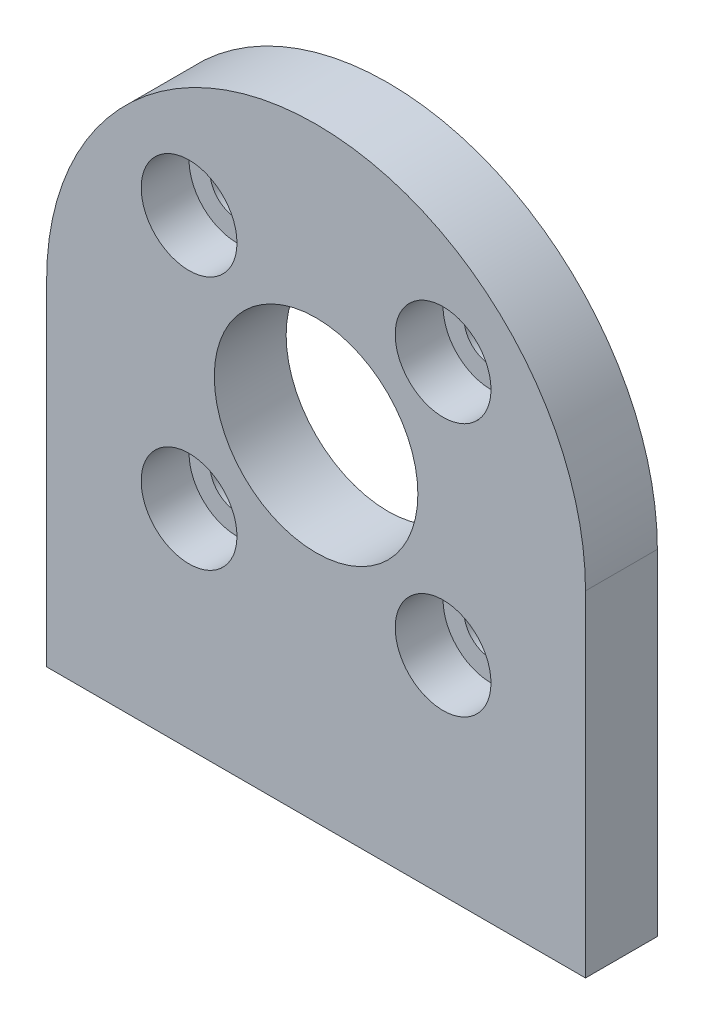
ISO-10303-21;
HEADER;
FILE_DESCRIPTION(('STEP AP214'),'2;1');
FILE_NAME('part.step','',(''),(''),'','','');
FILE_SCHEMA(('AUTOMOTIVE_DESIGN { 1 0 10303 214 1 1 1 1 }'));
ENDSEC;
DATA;
#1=APPLICATION_CONTEXT('core data for automotive mechanical design processes');
#2=APPLICATION_PROTOCOL_DEFINITION('international standard','automotive_design',2000,#1);
#3=PRODUCT_CONTEXT('',#1,'mechanical');
#4=PRODUCT('Part','Part','',(#3));
#5=PRODUCT_RELATED_PRODUCT_CATEGORY('part','',(#4));
#6=PRODUCT_DEFINITION_FORMATION('','',#4);
#7=PRODUCT_DEFINITION_CONTEXT('part definition',#1,'design');
#8=PRODUCT_DEFINITION('design','',#6,#7);
#9=PRODUCT_DEFINITION_SHAPE('','',#8);
#10=(LENGTH_UNIT() NAMED_UNIT(*) SI_UNIT(.MILLI.,.METRE.));
#11=(NAMED_UNIT(*) PLANE_ANGLE_UNIT() SI_UNIT($,.RADIAN.));
#12=(NAMED_UNIT(*) SI_UNIT($,.STERADIAN.) SOLID_ANGLE_UNIT());
#13=UNCERTAINTY_MEASURE_WITH_UNIT(LENGTH_MEASURE(1.E-05),#10,'distance_accuracy_value','');
#14=(GEOMETRIC_REPRESENTATION_CONTEXT(3) GLOBAL_UNCERTAINTY_ASSIGNED_CONTEXT((#13)) GLOBAL_UNIT_ASSIGNED_CONTEXT((#10,
#11,#12)) REPRESENTATION_CONTEXT('',''));
#15=CARTESIAN_POINT('',(0.,0.,0.));
#16=DIRECTION('',(0.,0.,1.));
#17=DIRECTION('',(1.,0.,0.));
#18=AXIS2_PLACEMENT_3D('',#15,#16,#17);
#19=CARTESIAN_POINT('',(22.5,28.,6.));
#20=DIRECTION('',(0.,0.,-1.));
#21=DIRECTION('',(-1.,0.,0.));
#22=AXIS2_PLACEMENT_3D('',#19,#20,#21);
#23=CYLINDRICAL_SURFACE('',#22,22.5);
#24=CARTESIAN_POINT('',(22.5,28.,0.));
#25=DIRECTION('',(0.,0.,1.));
#26=DIRECTION('',(1.,0.,0.));
#27=AXIS2_PLACEMENT_3D('',#24,#25,#26);
#28=CIRCLE('',#27,22.5);
#29=CARTESIAN_POINT('',(45.,28.,0.));
#30=VERTEX_POINT('',#29);
#31=CARTESIAN_POINT('',(0.,28.,0.));
#32=VERTEX_POINT('',#31);
#33=EDGE_CURVE('E98',#30,#32,#28,.T.);
#34=ORIENTED_EDGE('',*,*,#33,.T.);
#35=DIRECTION('',(0.,0.,-1.));
#36=VECTOR('',#35,1.);
#37=CARTESIAN_POINT('',(0.,28.,6.));
#38=LINE('',#37,#36);
#39=CARTESIAN_POINT('',(0.,28.,6.));
#40=VERTEX_POINT('',#39);
#41=EDGE_CURVE('E11',#40,#32,#38,.T.);
#42=ORIENTED_EDGE('',*,*,#41,.F.);
#43=CARTESIAN_POINT('',(22.5,28.,6.));
#44=DIRECTION('',(0.,0.,1.));
#45=DIRECTION('',(1.,0.,0.));
#46=AXIS2_PLACEMENT_3D('',#43,#44,#45);
#47=CIRCLE('',#46,22.5);
#48=CARTESIAN_POINT('',(45.,28.,6.));
#49=VERTEX_POINT('',#48);
#50=EDGE_CURVE('E86',#49,#40,#47,.T.);
#51=ORIENTED_EDGE('',*,*,#50,.F.);
#52=DIRECTION('',(0.,0.,-1.));
#53=VECTOR('',#52,1.);
#54=CARTESIAN_POINT('',(45.,28.,6.));
#55=LINE('',#54,#53);
#56=EDGE_CURVE('E94',#49,#30,#55,.T.);
#57=ORIENTED_EDGE('',*,*,#56,.T.);
#58=EDGE_LOOP('',(#34,#42,#51,#57));
#59=FACE_BOUND('',#58,.T.);
#60=ADVANCED_FACE('F35',(#59),#23,.T.);
#61=CARTESIAN_POINT('',(0.,28.,6.));
#62=DIRECTION('',(1.,0.,0.));
#63=DIRECTION('',(0.,1.,0.));
#64=AXIS2_PLACEMENT_3D('',#61,#62,#63);
#65=PLANE('',#64);
#66=DIRECTION('',(0.,-1.,0.));
#67=VECTOR('',#66,1.);
#68=CARTESIAN_POINT('',(0.,28.,0.));
#69=LINE('',#68,#67);
#70=CARTESIAN_POINT('',(0.,0.,0.));
#71=VERTEX_POINT('',#70);
#72=EDGE_CURVE('E90',#32,#71,#69,.T.);
#73=ORIENTED_EDGE('',*,*,#72,.T.);
#74=DIRECTION('',(0.,0.,-1.));
#75=VECTOR('',#74,1.);
#76=CARTESIAN_POINT('',(0.,0.,6.));
#77=LINE('',#76,#75);
#78=CARTESIAN_POINT('',(0.,0.,6.));
#79=VERTEX_POINT('',#78);
#80=EDGE_CURVE('E43',#79,#71,#77,.T.);
#81=ORIENTED_EDGE('',*,*,#80,.F.);
#82=DIRECTION('',(0.,-1.,0.));
#83=VECTOR('',#82,1.);
#84=CARTESIAN_POINT('',(0.,28.,6.));
#85=LINE('',#84,#83);
#86=EDGE_CURVE('E81',#40,#79,#85,.T.);
#87=ORIENTED_EDGE('',*,*,#86,.F.);
#88=ORIENTED_EDGE('',*,*,#41,.T.);
#89=EDGE_LOOP('',(#73,#81,#87,#88));
#90=FACE_BOUND('',#89,.T.);
#91=ADVANCED_FACE('F89',(#90),#65,.F.);
#92=CARTESIAN_POINT('',(0.,0.,6.));
#93=DIRECTION('',(0.,1.,0.));
#94=DIRECTION('',(0.,0.,1.));
#95=AXIS2_PLACEMENT_3D('',#92,#93,#94);
#96=PLANE('',#95);
#97=DIRECTION('',(1.,0.,0.));
#98=VECTOR('',#97,1.);
#99=CARTESIAN_POINT('',(0.,0.,0.));
#100=LINE('',#99,#98);
#101=CARTESIAN_POINT('',(45.,0.,0.));
#102=VERTEX_POINT('',#101);
#103=EDGE_CURVE('E68',#71,#102,#100,.T.);
#104=ORIENTED_EDGE('',*,*,#103,.T.);
#105=DIRECTION('',(0.,0.,-1.));
#106=VECTOR('',#105,1.);
#107=CARTESIAN_POINT('',(45.,0.,6.));
#108=LINE('',#107,#106);
#109=CARTESIAN_POINT('',(45.,0.,6.));
#110=VERTEX_POINT('',#109);
#111=EDGE_CURVE('E91',#110,#102,#108,.T.);
#112=ORIENTED_EDGE('',*,*,#111,.F.);
#113=DIRECTION('',(1.,0.,0.));
#114=VECTOR('',#113,1.);
#115=CARTESIAN_POINT('',(0.,0.,6.));
#116=LINE('',#115,#114);
#117=EDGE_CURVE('E84',#79,#110,#116,.T.);
#118=ORIENTED_EDGE('',*,*,#117,.F.);
#119=ORIENTED_EDGE('',*,*,#80,.T.);
#120=EDGE_LOOP('',(#104,#112,#118,#119));
#121=FACE_BOUND('',#120,.T.);
#122=ADVANCED_FACE('F92',(#121),#96,.F.);
#123=CARTESIAN_POINT('',(45.,28.,6.));
#124=DIRECTION('',(-1.,0.,0.));
#125=DIRECTION('',(0.,0.,1.));
#126=AXIS2_PLACEMENT_3D('',#123,#124,#125);
#127=PLANE('',#126);
#128=DIRECTION('',(0.,1.,0.));
#129=VECTOR('',#128,1.);
#130=CARTESIAN_POINT('',(45.,28.,0.));
#131=LINE('',#130,#129);
#132=EDGE_CURVE('E74',#102,#30,#131,.T.);
#133=ORIENTED_EDGE('',*,*,#132,.T.);
#134=ORIENTED_EDGE('',*,*,#56,.F.);
#135=DIRECTION('',(0.,1.,0.));
#136=VECTOR('',#135,1.);
#137=CARTESIAN_POINT('',(45.,28.,6.));
#138=LINE('',#137,#136);
#139=EDGE_CURVE('E51',#110,#49,#138,.T.);
#140=ORIENTED_EDGE('',*,*,#139,.F.);
#141=ORIENTED_EDGE('',*,*,#111,.T.);
#142=EDGE_LOOP('',(#133,#134,#140,#141));
#143=FACE_BOUND('',#142,.T.);
#144=ADVANCED_FACE('F106',(#143),#127,.F.);
#145=CARTESIAN_POINT('',(22.5,28.,6.));
#146=DIRECTION('',(0.,0.,1.));
#147=DIRECTION('',(1.,0.,0.));
#148=AXIS2_PLACEMENT_3D('',#145,#146,#147);
#149=PLANE('',#148);
#150=CARTESIAN_POINT('',(11.8933982822019,38.6066017177983,6.));
#151=DIRECTION('',(0.,0.,1.));
#152=DIRECTION('',(1.,0.,0.));
#153=AXIS2_PLACEMENT_3D('',#150,#151,#152);
#154=CIRCLE('',#153,3.99999999999999);
#155=CARTESIAN_POINT('',(15.8933982822019,38.6066017177983,6.));
#156=VERTEX_POINT('',#155);
#157=EDGE_CURVE('E162',#156,#156,#154,.T.);
#158=ORIENTED_EDGE('',*,*,#157,.F.);
#159=EDGE_LOOP('',(#158));
#160=FACE_BOUND('',#159,.T.);
#161=CARTESIAN_POINT('',(33.1066017177985,38.6066017177983,6.));
#162=DIRECTION('',(0.,0.,1.));
#163=DIRECTION('',(1.,0.,0.));
#164=AXIS2_PLACEMENT_3D('',#161,#162,#163);
#165=CIRCLE('',#164,3.99999999999999);
#166=CARTESIAN_POINT('',(37.1066017177985,38.6066017177983,6.));
#167=VERTEX_POINT('',#166);
#168=EDGE_CURVE('E150',#167,#167,#165,.T.);
#169=ORIENTED_EDGE('',*,*,#168,.F.);
#170=EDGE_LOOP('',(#169));
#171=FACE_BOUND('',#170,.T.);
#172=CARTESIAN_POINT('',(33.1066017177985,17.3933982822017,6.));
#173=DIRECTION('',(0.,0.,1.));
#174=DIRECTION('',(1.,0.,0.));
#175=AXIS2_PLACEMENT_3D('',#172,#173,#174);
#176=CIRCLE('',#175,4.);
#177=CARTESIAN_POINT('',(37.1066017177985,17.3933982822017,6.));
#178=VERTEX_POINT('',#177);
#179=EDGE_CURVE('E138',#178,#178,#176,.T.);
#180=ORIENTED_EDGE('',*,*,#179,.F.);
#181=EDGE_LOOP('',(#180));
#182=FACE_BOUND('',#181,.T.);
#183=CARTESIAN_POINT('',(11.8933982822019,17.3933982822017,6.));
#184=DIRECTION('',(0.,0.,1.));
#185=DIRECTION('',(1.,0.,0.));
#186=AXIS2_PLACEMENT_3D('',#183,#184,#185);
#187=CIRCLE('',#186,3.99999999999999);
#188=CARTESIAN_POINT('',(15.8933982822019,17.3933982822017,6.));
#189=VERTEX_POINT('',#188);
#190=EDGE_CURVE('E126',#189,#189,#187,.T.);
#191=ORIENTED_EDGE('',*,*,#190,.F.);
#192=EDGE_LOOP('',(#191));
#193=FACE_BOUND('',#192,.T.);
#194=CARTESIAN_POINT('',(22.5,28.,6.));
#195=DIRECTION('',(0.,0.,1.));
#196=DIRECTION('',(1.,0.,0.));
#197=AXIS2_PLACEMENT_3D('',#194,#195,#196);
#198=CIRCLE('',#197,8.5);
#199=CARTESIAN_POINT('',(31.,28.,6.));
#200=VERTEX_POINT('',#199);
#201=EDGE_CURVE('E112',#200,#200,#198,.T.);
#202=ORIENTED_EDGE('',*,*,#201,.F.);
#203=EDGE_LOOP('',(#202));
#204=FACE_BOUND('',#203,.T.);
#205=ORIENTED_EDGE('',*,*,#50,.T.);
#206=ORIENTED_EDGE('',*,*,#86,.T.);
#207=ORIENTED_EDGE('',*,*,#117,.T.);
#208=ORIENTED_EDGE('',*,*,#139,.T.);
#209=EDGE_LOOP('',(#205,#206,#207,#208));
#210=FACE_BOUND('',#209,.T.);
#211=ADVANCED_FACE('F82',(#160,#171,#182,#193,#204,#210),#149,.T.);
#212=CARTESIAN_POINT('',(22.5,28.,0.));
#213=DIRECTION('',(0.,0.,1.));
#214=DIRECTION('',(1.,0.,0.));
#215=AXIS2_PLACEMENT_3D('',#212,#213,#214);
#216=PLANE('',#215);
#217=CARTESIAN_POINT('',(11.8933982822019,38.6066017177983,0.));
#218=DIRECTION('',(0.,0.,1.));
#219=DIRECTION('',(1.,0.,0.));
#220=AXIS2_PLACEMENT_3D('',#217,#218,#219);
#221=CIRCLE('',#220,2.25);
#222=CARTESIAN_POINT('',(14.1433982822019,38.6066017177983,0.));
#223=VERTEX_POINT('',#222);
#224=EDGE_CURVE('E153',#223,#223,#221,.T.);
#225=ORIENTED_EDGE('',*,*,#224,.T.);
#226=EDGE_LOOP('',(#225));
#227=FACE_BOUND('',#226,.T.);
#228=CARTESIAN_POINT('',(33.1066017177985,38.6066017177983,0.));
#229=DIRECTION('',(0.,0.,1.));
#230=DIRECTION('',(1.,0.,0.));
#231=AXIS2_PLACEMENT_3D('',#228,#229,#230);
#232=CIRCLE('',#231,2.25);
#233=CARTESIAN_POINT('',(35.3566017177985,38.6066017177983,0.));
#234=VERTEX_POINT('',#233);
#235=EDGE_CURVE('E141',#234,#234,#232,.T.);
#236=ORIENTED_EDGE('',*,*,#235,.T.);
#237=EDGE_LOOP('',(#236));
#238=FACE_BOUND('',#237,.T.);
#239=CARTESIAN_POINT('',(33.1066017177985,17.3933982822017,0.));
#240=DIRECTION('',(0.,0.,1.));
#241=DIRECTION('',(1.,0.,0.));
#242=AXIS2_PLACEMENT_3D('',#239,#240,#241);
#243=CIRCLE('',#242,2.25);
#244=CARTESIAN_POINT('',(35.3566017177985,17.3933982822017,0.));
#245=VERTEX_POINT('',#244);
#246=EDGE_CURVE('E129',#245,#245,#243,.T.);
#247=ORIENTED_EDGE('',*,*,#246,.T.);
#248=EDGE_LOOP('',(#247));
#249=FACE_BOUND('',#248,.T.);
#250=CARTESIAN_POINT('',(11.8933982822019,17.3933982822017,0.));
#251=DIRECTION('',(0.,0.,1.));
#252=DIRECTION('',(1.,0.,0.));
#253=AXIS2_PLACEMENT_3D('',#250,#251,#252);
#254=CIRCLE('',#253,2.25);
#255=CARTESIAN_POINT('',(14.1433982822019,17.3933982822017,0.));
#256=VERTEX_POINT('',#255);
#257=EDGE_CURVE('E115',#256,#256,#254,.T.);
#258=ORIENTED_EDGE('',*,*,#257,.T.);
#259=EDGE_LOOP('',(#258));
#260=FACE_BOUND('',#259,.T.);
#261=CARTESIAN_POINT('',(22.5,28.,0.));
#262=DIRECTION('',(0.,0.,1.));
#263=DIRECTION('',(1.,0.,0.));
#264=AXIS2_PLACEMENT_3D('',#261,#262,#263);
#265=CIRCLE('',#264,8.5);
#266=CARTESIAN_POINT('',(31.,28.,0.));
#267=VERTEX_POINT('',#266);
#268=EDGE_CURVE('E101',#267,#267,#265,.T.);
#269=ORIENTED_EDGE('',*,*,#268,.T.);
#270=EDGE_LOOP('',(#269));
#271=FACE_BOUND('',#270,.T.);
#272=ORIENTED_EDGE('',*,*,#33,.F.);
#273=ORIENTED_EDGE('',*,*,#132,.F.);
#274=ORIENTED_EDGE('',*,*,#103,.F.);
#275=ORIENTED_EDGE('',*,*,#72,.F.);
#276=EDGE_LOOP('',(#272,#273,#274,#275));
#277=FACE_BOUND('',#276,.T.);
#278=ADVANCED_FACE('F109',(#227,#238,#249,#260,#271,#277),#216,.F.);
#279=CARTESIAN_POINT('',(22.5,28.,0.));
#280=DIRECTION('',(0.,0.,1.));
#281=DIRECTION('',(1.,0.,0.));
#282=AXIS2_PLACEMENT_3D('',#279,#280,#281);
#283=CYLINDRICAL_SURFACE('',#282,8.5);
#284=ORIENTED_EDGE('',*,*,#268,.F.);
#285=EDGE_LOOP('',(#284));
#286=FACE_BOUND('',#285,.T.);
#287=ORIENTED_EDGE('',*,*,#201,.T.);
#288=EDGE_LOOP('',(#287));
#289=FACE_BOUND('',#288,.T.);
#290=ADVANCED_FACE('F179',(#286,#289),#283,.F.);
#291=CARTESIAN_POINT('',(11.8933982822019,17.3933982822017,6.));
#292=DIRECTION('',(0.,0.,1.));
#293=DIRECTION('',(1.,0.,0.));
#294=AXIS2_PLACEMENT_3D('',#291,#292,#293);
#295=CYLINDRICAL_SURFACE('',#294,2.25);
#296=ORIENTED_EDGE('',*,*,#257,.F.);
#297=EDGE_LOOP('',(#296));
#298=FACE_BOUND('',#297,.T.);
#299=CARTESIAN_POINT('',(11.8933982822019,17.3933982822017,2.));
#300=DIRECTION('',(0.,0.,1.));
#301=DIRECTION('',(1.,0.,0.));
#302=AXIS2_PLACEMENT_3D('',#299,#300,#301);
#303=CIRCLE('',#302,2.25);
#304=CARTESIAN_POINT('',(14.1433982822019,17.3933982822017,2.));
#305=VERTEX_POINT('',#304);
#306=EDGE_CURVE('E120',#305,#305,#303,.T.);
#307=ORIENTED_EDGE('',*,*,#306,.T.);
#308=EDGE_LOOP('',(#307));
#309=FACE_BOUND('',#308,.T.);
#310=ADVANCED_FACE('F181',(#298,#309),#295,.F.);
#311=CARTESIAN_POINT('',(14.1433982822019,17.3933982822017,2.));
#312=DIRECTION('',(0.,0.,-1.));
#313=DIRECTION('',(-1.,0.,0.));
#314=AXIS2_PLACEMENT_3D('',#311,#312,#313);
#315=PLANE('',#314);
#316=ORIENTED_EDGE('',*,*,#306,.F.);
#317=EDGE_LOOP('',(#316));
#318=FACE_BOUND('',#317,.T.);
#319=CARTESIAN_POINT('',(11.8933982822019,17.3933982822017,2.));
#320=DIRECTION('',(0.,0.,1.));
#321=DIRECTION('',(1.,0.,0.));
#322=AXIS2_PLACEMENT_3D('',#319,#320,#321);
#323=CIRCLE('',#322,3.99999999999999);
#324=CARTESIAN_POINT('',(15.8933982822019,17.3933982822017,2.));
#325=VERTEX_POINT('',#324);
#326=EDGE_CURVE('E123',#325,#325,#323,.T.);
#327=ORIENTED_EDGE('',*,*,#326,.T.);
#328=EDGE_LOOP('',(#327));
#329=FACE_BOUND('',#328,.T.);
#330=ADVANCED_FACE('F188',(#318,#329),#315,.F.);
#331=CARTESIAN_POINT('',(11.8933982822019,17.3933982822017,6.));
#332=DIRECTION('',(0.,0.,1.));
#333=DIRECTION('',(1.,0.,0.));
#334=AXIS2_PLACEMENT_3D('',#331,#332,#333);
#335=CYLINDRICAL_SURFACE('',#334,3.99999999999999);
#336=ORIENTED_EDGE('',*,*,#326,.F.);
#337=EDGE_LOOP('',(#336));
#338=FACE_BOUND('',#337,.T.);
#339=ORIENTED_EDGE('',*,*,#190,.T.);
#340=EDGE_LOOP('',(#339));
#341=FACE_BOUND('',#340,.T.);
#342=ADVANCED_FACE('F232',(#338,#341),#335,.F.);
#343=CARTESIAN_POINT('',(33.1066017177985,17.3933982822017,6.));
#344=DIRECTION('',(0.,0.,1.));
#345=DIRECTION('',(1.,0.,0.));
#346=AXIS2_PLACEMENT_3D('',#343,#344,#345);
#347=CYLINDRICAL_SURFACE('',#346,2.25);
#348=ORIENTED_EDGE('',*,*,#246,.F.);
#349=EDGE_LOOP('',(#348));
#350=FACE_BOUND('',#349,.T.);
#351=CARTESIAN_POINT('',(33.1066017177985,17.3933982822017,2.));
#352=DIRECTION('',(0.,0.,1.));
#353=DIRECTION('',(1.,0.,0.));
#354=AXIS2_PLACEMENT_3D('',#351,#352,#353);
#355=CIRCLE('',#354,2.25);
#356=CARTESIAN_POINT('',(35.3566017177985,17.3933982822017,2.));
#357=VERTEX_POINT('',#356);
#358=EDGE_CURVE('E132',#357,#357,#355,.T.);
#359=ORIENTED_EDGE('',*,*,#358,.T.);
#360=EDGE_LOOP('',(#359));
#361=FACE_BOUND('',#360,.T.);
#362=ADVANCED_FACE('F242',(#350,#361),#347,.F.);
#363=CARTESIAN_POINT('',(35.3566017177985,17.3933982822017,2.));
#364=DIRECTION('',(0.,0.,-1.));
#365=DIRECTION('',(-1.,0.,0.));
#366=AXIS2_PLACEMENT_3D('',#363,#364,#365);
#367=PLANE('',#366);
#368=ORIENTED_EDGE('',*,*,#358,.F.);
#369=EDGE_LOOP('',(#368));
#370=FACE_BOUND('',#369,.T.);
#371=CARTESIAN_POINT('',(33.1066017177985,17.3933982822017,2.));
#372=DIRECTION('',(0.,0.,1.));
#373=DIRECTION('',(1.,0.,0.));
#374=AXIS2_PLACEMENT_3D('',#371,#372,#373);
#375=CIRCLE('',#374,4.);
#376=CARTESIAN_POINT('',(37.1066017177985,17.3933982822017,2.));
#377=VERTEX_POINT('',#376);
#378=EDGE_CURVE('E135',#377,#377,#375,.T.);
#379=ORIENTED_EDGE('',*,*,#378,.T.);
#380=EDGE_LOOP('',(#379));
#381=FACE_BOUND('',#380,.T.);
#382=ADVANCED_FACE('F252',(#370,#381),#367,.F.);
#383=CARTESIAN_POINT('',(33.1066017177985,17.3933982822017,6.));
#384=DIRECTION('',(0.,0.,1.));
#385=DIRECTION('',(1.,0.,0.));
#386=AXIS2_PLACEMENT_3D('',#383,#384,#385);
#387=CYLINDRICAL_SURFACE('',#386,4.);
#388=ORIENTED_EDGE('',*,*,#378,.F.);
#389=EDGE_LOOP('',(#388));
#390=FACE_BOUND('',#389,.T.);
#391=ORIENTED_EDGE('',*,*,#179,.T.);
#392=EDGE_LOOP('',(#391));
#393=FACE_BOUND('',#392,.T.);
#394=ADVANCED_FACE('F262',(#390,#393),#387,.F.);
#395=CARTESIAN_POINT('',(33.1066017177985,38.6066017177983,6.));
#396=DIRECTION('',(0.,0.,1.));
#397=DIRECTION('',(1.,0.,0.));
#398=AXIS2_PLACEMENT_3D('',#395,#396,#397);
#399=CYLINDRICAL_SURFACE('',#398,2.25);
#400=ORIENTED_EDGE('',*,*,#235,.F.);
#401=EDGE_LOOP('',(#400));
#402=FACE_BOUND('',#401,.T.);
#403=CARTESIAN_POINT('',(33.1066017177985,38.6066017177983,2.));
#404=DIRECTION('',(0.,0.,1.));
#405=DIRECTION('',(1.,0.,0.));
#406=AXIS2_PLACEMENT_3D('',#403,#404,#405);
#407=CIRCLE('',#406,2.25);
#408=CARTESIAN_POINT('',(35.3566017177985,38.6066017177983,2.));
#409=VERTEX_POINT('',#408);
#410=EDGE_CURVE('E144',#409,#409,#407,.T.);
#411=ORIENTED_EDGE('',*,*,#410,.T.);
#412=EDGE_LOOP('',(#411));
#413=FACE_BOUND('',#412,.T.);
#414=ADVANCED_FACE('F272',(#402,#413),#399,.F.);
#415=CARTESIAN_POINT('',(35.3566017177985,38.6066017177983,2.));
#416=DIRECTION('',(0.,0.,-1.));
#417=DIRECTION('',(-1.,0.,0.));
#418=AXIS2_PLACEMENT_3D('',#415,#416,#417);
#419=PLANE('',#418);
#420=ORIENTED_EDGE('',*,*,#410,.F.);
#421=EDGE_LOOP('',(#420));
#422=FACE_BOUND('',#421,.T.);
#423=CARTESIAN_POINT('',(33.1066017177985,38.6066017177983,2.));
#424=DIRECTION('',(0.,0.,1.));
#425=DIRECTION('',(1.,0.,0.));
#426=AXIS2_PLACEMENT_3D('',#423,#424,#425);
#427=CIRCLE('',#426,4.);
#428=CARTESIAN_POINT('',(37.1066017177985,38.6066017177983,2.));
#429=VERTEX_POINT('',#428);
#430=EDGE_CURVE('E147',#429,#429,#427,.T.);
#431=ORIENTED_EDGE('',*,*,#430,.T.);
#432=EDGE_LOOP('',(#431));
#433=FACE_BOUND('',#432,.T.);
#434=ADVANCED_FACE('F282',(#422,#433),#419,.F.);
#435=CARTESIAN_POINT('',(33.1066017177985,38.6066017177983,6.));
#436=DIRECTION('',(0.,0.,1.));
#437=DIRECTION('',(1.,0.,0.));
#438=AXIS2_PLACEMENT_3D('',#435,#436,#437);
#439=CYLINDRICAL_SURFACE('',#438,3.99999999999999);
#440=ORIENTED_EDGE('',*,*,#430,.F.);
#441=EDGE_LOOP('',(#440));
#442=FACE_BOUND('',#441,.T.);
#443=ORIENTED_EDGE('',*,*,#168,.T.);
#444=EDGE_LOOP('',(#443));
#445=FACE_BOUND('',#444,.T.);
#446=ADVANCED_FACE('F292',(#442,#445),#439,.F.);
#447=CARTESIAN_POINT('',(11.8933982822019,38.6066017177983,6.));
#448=DIRECTION('',(0.,0.,1.));
#449=DIRECTION('',(1.,0.,0.));
#450=AXIS2_PLACEMENT_3D('',#447,#448,#449);
#451=CYLINDRICAL_SURFACE('',#450,2.25);
#452=ORIENTED_EDGE('',*,*,#224,.F.);
#453=EDGE_LOOP('',(#452));
#454=FACE_BOUND('',#453,.T.);
#455=CARTESIAN_POINT('',(11.8933982822019,38.6066017177983,2.));
#456=DIRECTION('',(0.,0.,1.));
#457=DIRECTION('',(1.,0.,0.));
#458=AXIS2_PLACEMENT_3D('',#455,#456,#457);
#459=CIRCLE('',#458,2.25);
#460=CARTESIAN_POINT('',(14.1433982822019,38.6066017177983,2.));
#461=VERTEX_POINT('',#460);
#462=EDGE_CURVE('E156',#461,#461,#459,.T.);
#463=ORIENTED_EDGE('',*,*,#462,.T.);
#464=EDGE_LOOP('',(#463));
#465=FACE_BOUND('',#464,.T.);
#466=ADVANCED_FACE('F302',(#454,#465),#451,.F.);
#467=CARTESIAN_POINT('',(14.1433982822019,38.6066017177983,2.));
#468=DIRECTION('',(0.,0.,-1.));
#469=DIRECTION('',(-1.,0.,0.));
#470=AXIS2_PLACEMENT_3D('',#467,#468,#469);
#471=PLANE('',#470);
#472=ORIENTED_EDGE('',*,*,#462,.F.);
#473=EDGE_LOOP('',(#472));
#474=FACE_BOUND('',#473,.T.);
#475=CARTESIAN_POINT('',(11.8933982822019,38.6066017177983,2.));
#476=DIRECTION('',(0.,0.,1.));
#477=DIRECTION('',(1.,0.,0.));
#478=AXIS2_PLACEMENT_3D('',#475,#476,#477);
#479=CIRCLE('',#478,3.99999999999999);
#480=CARTESIAN_POINT('',(15.8933982822019,38.6066017177983,2.));
#481=VERTEX_POINT('',#480);
#482=EDGE_CURVE('E159',#481,#481,#479,.T.);
#483=ORIENTED_EDGE('',*,*,#482,.T.);
#484=EDGE_LOOP('',(#483));
#485=FACE_BOUND('',#484,.T.);
#486=ADVANCED_FACE('F312',(#474,#485),#471,.F.);
#487=CARTESIAN_POINT('',(11.8933982822019,38.6066017177983,6.));
#488=DIRECTION('',(0.,0.,1.));
#489=DIRECTION('',(1.,0.,0.));
#490=AXIS2_PLACEMENT_3D('',#487,#488,#489);
#491=CYLINDRICAL_SURFACE('',#490,3.99999999999999);
#492=ORIENTED_EDGE('',*,*,#482,.F.);
#493=EDGE_LOOP('',(#492));
#494=FACE_BOUND('',#493,.T.);
#495=ORIENTED_EDGE('',*,*,#157,.T.);
#496=EDGE_LOOP('',(#495));
#497=FACE_BOUND('',#496,.T.);
#498=ADVANCED_FACE('F166',(#494,#497),#491,.F.);
#499=CLOSED_SHELL('',(#60,#91,#122,#144,#211,#278,#290,#310,#330,#342,#362,#382,#394,#414,#434,
#446,#466,#486,#498));
#500=MANIFOLD_SOLID_BREP('B2',#499);
#501=ADVANCED_BREP_SHAPE_REPRESENTATION('',(#18,#500),#14);
#502=SHAPE_DEFINITION_REPRESENTATION(#9,#501);
ENDSEC;
END-ISO-10303-21;
